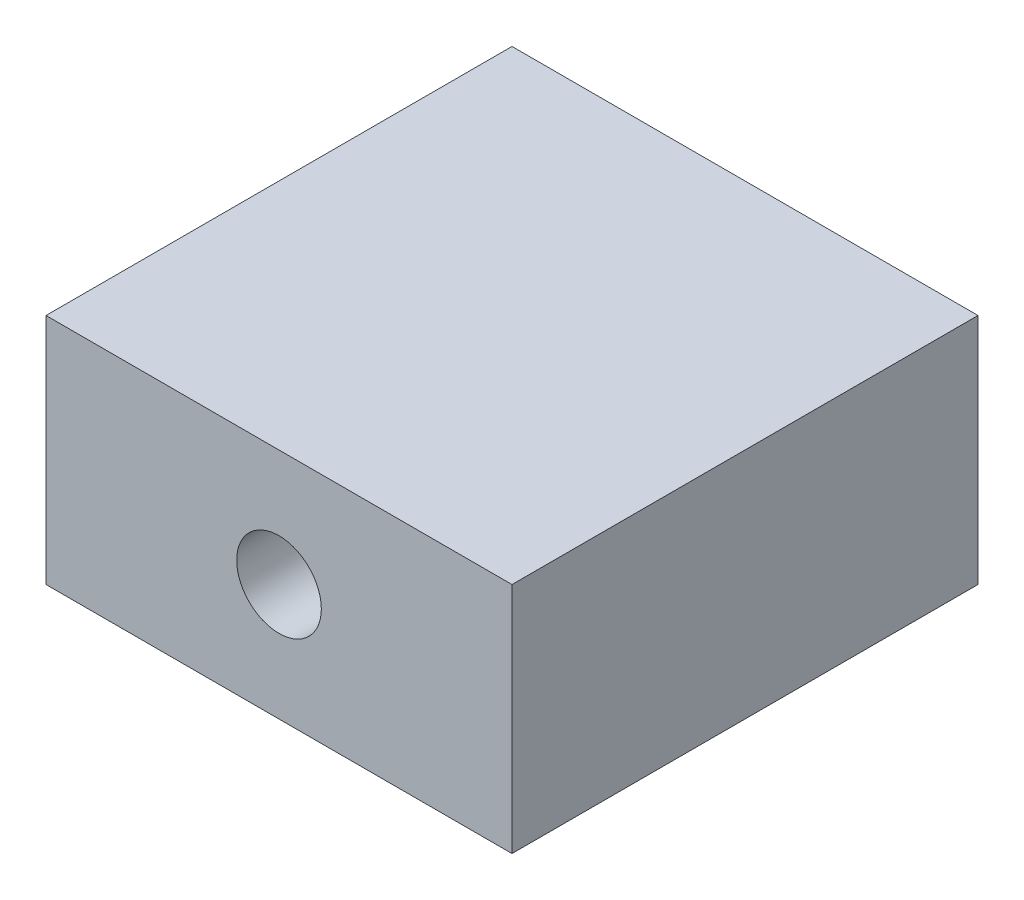
ISO-10303-21;
HEADER;
FILE_DESCRIPTION(('STEP AP214'),'2;1');
FILE_NAME('part.step','',(''),(''),'','','');
FILE_SCHEMA(('AUTOMOTIVE_DESIGN { 1 0 10303 214 1 1 1 1 }'));
ENDSEC;
DATA;
#1=APPLICATION_CONTEXT('core data for automotive mechanical design processes');
#2=APPLICATION_PROTOCOL_DEFINITION('international standard','automotive_design',2000,#1);
#3=PRODUCT_CONTEXT('',#1,'mechanical');
#4=PRODUCT('Part','Part','',(#3));
#5=PRODUCT_RELATED_PRODUCT_CATEGORY('part','',(#4));
#6=PRODUCT_DEFINITION_FORMATION('','',#4);
#7=PRODUCT_DEFINITION_CONTEXT('part definition',#1,'design');
#8=PRODUCT_DEFINITION('design','',#6,#7);
#9=PRODUCT_DEFINITION_SHAPE('','',#8);
#10=(LENGTH_UNIT() NAMED_UNIT(*) SI_UNIT(.MILLI.,.METRE.));
#11=(NAMED_UNIT(*) PLANE_ANGLE_UNIT() SI_UNIT($,.RADIAN.));
#12=(NAMED_UNIT(*) SI_UNIT($,.STERADIAN.) SOLID_ANGLE_UNIT());
#13=UNCERTAINTY_MEASURE_WITH_UNIT(LENGTH_MEASURE(1.E-05),#10,'distance_accuracy_value','');
#14=(GEOMETRIC_REPRESENTATION_CONTEXT(3) GLOBAL_UNCERTAINTY_ASSIGNED_CONTEXT((#13)) GLOBAL_UNIT_ASSIGNED_CONTEXT((#10,
#11,#12)) REPRESENTATION_CONTEXT('',''));
#15=CARTESIAN_POINT('',(0.,0.,0.));
#16=DIRECTION('',(0.,0.,1.));
#17=DIRECTION('',(1.,0.,0.));
#18=AXIS2_PLACEMENT_3D('',#15,#16,#17);
#19=CARTESIAN_POINT('',(76.2,-38.1,152.4));
#20=DIRECTION('',(-1.,0.,0.));
#21=DIRECTION('',(0.,0.,1.));
#22=AXIS2_PLACEMENT_3D('',#19,#20,#21);
#23=PLANE('',#22);
#24=DIRECTION('',(0.,1.,0.));
#25=VECTOR('',#24,1.);
#26=CARTESIAN_POINT('',(76.2,-38.1,0.));
#27=LINE('',#26,#25);
#28=CARTESIAN_POINT('',(76.2,-38.1,0.));
#29=VERTEX_POINT('',#28);
#30=CARTESIAN_POINT('',(76.2,38.1,0.));
#31=VERTEX_POINT('',#30);
#32=EDGE_CURVE('E106',#29,#31,#27,.T.);
#33=ORIENTED_EDGE('',*,*,#32,.T.);
#34=DIRECTION('',(0.,0.,-1.));
#35=VECTOR('',#34,1.);
#36=CARTESIAN_POINT('',(76.2,38.1,152.4));
#37=LINE('',#36,#35);
#38=CARTESIAN_POINT('',(76.2,38.1,152.4));
#39=VERTEX_POINT('',#38);
#40=EDGE_CURVE('E11',#39,#31,#37,.T.);
#41=ORIENTED_EDGE('',*,*,#40,.F.);
#42=DIRECTION('',(0.,1.,0.));
#43=VECTOR('',#42,1.);
#44=CARTESIAN_POINT('',(76.2,-38.1,152.4));
#45=LINE('',#44,#43);
#46=CARTESIAN_POINT('',(76.2,-38.1,152.4));
#47=VERTEX_POINT('',#46);
#48=EDGE_CURVE('E94',#47,#39,#45,.T.);
#49=ORIENTED_EDGE('',*,*,#48,.F.);
#50=DIRECTION('',(0.,0.,-1.));
#51=VECTOR('',#50,1.);
#52=CARTESIAN_POINT('',(76.2,-38.1,152.4));
#53=LINE('',#52,#51);
#54=EDGE_CURVE('E102',#47,#29,#53,.T.);
#55=ORIENTED_EDGE('',*,*,#54,.T.);
#56=EDGE_LOOP('',(#33,#41,#49,#55));
#57=FACE_BOUND('',#56,.T.);
#58=ADVANCED_FACE('F43',(#57),#23,.F.);
#59=CARTESIAN_POINT('',(-76.2,38.1,152.4));
#60=DIRECTION('',(0.,-1.,0.));
#61=DIRECTION('',(0.,0.,-1.));
#62=AXIS2_PLACEMENT_3D('',#59,#60,#61);
#63=PLANE('',#62);
#64=DIRECTION('',(-1.,0.,0.));
#65=VECTOR('',#64,1.);
#66=CARTESIAN_POINT('',(-76.2,38.1,0.));
#67=LINE('',#66,#65);
#68=CARTESIAN_POINT('',(-76.2,38.1,0.));
#69=VERTEX_POINT('',#68);
#70=EDGE_CURVE('E98',#31,#69,#67,.T.);
#71=ORIENTED_EDGE('',*,*,#70,.T.);
#72=DIRECTION('',(0.,0.,-1.));
#73=VECTOR('',#72,1.);
#74=CARTESIAN_POINT('',(-76.2,38.1,152.4));
#75=LINE('',#74,#73);
#76=CARTESIAN_POINT('',(-76.2,38.1,152.4));
#77=VERTEX_POINT('',#76);
#78=EDGE_CURVE('E51',#77,#69,#75,.T.);
#79=ORIENTED_EDGE('',*,*,#78,.F.);
#80=DIRECTION('',(-1.,0.,0.));
#81=VECTOR('',#80,1.);
#82=CARTESIAN_POINT('',(-76.2,38.1,152.4));
#83=LINE('',#82,#81);
#84=EDGE_CURVE('E89',#39,#77,#83,.T.);
#85=ORIENTED_EDGE('',*,*,#84,.F.);
#86=ORIENTED_EDGE('',*,*,#40,.T.);
#87=EDGE_LOOP('',(#71,#79,#85,#86));
#88=FACE_BOUND('',#87,.T.);
#89=ADVANCED_FACE('F97',(#88),#63,.F.);
#90=CARTESIAN_POINT('',(-76.2,-38.1,152.4));
#91=DIRECTION('',(1.,0.,0.));
#92=DIRECTION('',(0.,0.,-1.));
#93=AXIS2_PLACEMENT_3D('',#90,#91,#92);
#94=PLANE('',#93);
#95=DIRECTION('',(0.,-1.,0.));
#96=VECTOR('',#95,1.);
#97=CARTESIAN_POINT('',(-76.2,-38.1,0.));
#98=LINE('',#97,#96);
#99=CARTESIAN_POINT('',(-76.2,-38.1,0.));
#100=VERTEX_POINT('',#99);
#101=EDGE_CURVE('E76',#69,#100,#98,.T.);
#102=ORIENTED_EDGE('',*,*,#101,.T.);
#103=DIRECTION('',(0.,0.,-1.));
#104=VECTOR('',#103,1.);
#105=CARTESIAN_POINT('',(-76.2,-38.1,152.4));
#106=LINE('',#105,#104);
#107=CARTESIAN_POINT('',(-76.2,-38.1,152.4));
#108=VERTEX_POINT('',#107);
#109=EDGE_CURVE('E99',#108,#100,#106,.T.);
#110=ORIENTED_EDGE('',*,*,#109,.F.);
#111=DIRECTION('',(0.,-1.,0.));
#112=VECTOR('',#111,1.);
#113=CARTESIAN_POINT('',(-76.2,-38.1,152.4));
#114=LINE('',#113,#112);
#115=EDGE_CURVE('E92',#77,#108,#114,.T.);
#116=ORIENTED_EDGE('',*,*,#115,.F.);
#117=ORIENTED_EDGE('',*,*,#78,.T.);
#118=EDGE_LOOP('',(#102,#110,#116,#117));
#119=FACE_BOUND('',#118,.T.);
#120=ADVANCED_FACE('F100',(#119),#94,.F.);
#121=CARTESIAN_POINT('',(-76.2,-38.1,152.4));
#122=DIRECTION('',(0.,1.,0.));
#123=DIRECTION('',(0.,0.,1.));
#124=AXIS2_PLACEMENT_3D('',#121,#122,#123);
#125=PLANE('',#124);
#126=DIRECTION('',(1.,0.,0.));
#127=VECTOR('',#126,1.);
#128=CARTESIAN_POINT('',(-76.2,-38.1,0.));
#129=LINE('',#128,#127);
#130=EDGE_CURVE('E82',#100,#29,#129,.T.);
#131=ORIENTED_EDGE('',*,*,#130,.T.);
#132=ORIENTED_EDGE('',*,*,#54,.F.);
#133=DIRECTION('',(1.,0.,0.));
#134=VECTOR('',#133,1.);
#135=CARTESIAN_POINT('',(-76.2,-38.1,152.4));
#136=LINE('',#135,#134);
#137=EDGE_CURVE('E59',#108,#47,#136,.T.);
#138=ORIENTED_EDGE('',*,*,#137,.F.);
#139=ORIENTED_EDGE('',*,*,#109,.T.);
#140=EDGE_LOOP('',(#131,#132,#138,#139));
#141=FACE_BOUND('',#140,.T.);
#142=ADVANCED_FACE('F114',(#141),#125,.F.);
#143=CARTESIAN_POINT('',(0.,0.,152.4));
#144=DIRECTION('',(0.,0.,-1.));
#145=DIRECTION('',(-1.,0.,0.));
#146=AXIS2_PLACEMENT_3D('',#143,#144,#145);
#147=PLANE('',#146);
#148=CARTESIAN_POINT('',(0.,0.,152.4));
#149=DIRECTION('',(0.,0.,1.));
#150=DIRECTION('',(1.,0.,0.));
#151=AXIS2_PLACEMENT_3D('',#148,#149,#150);
#152=CIRCLE('',#151,13.843);
#153=CARTESIAN_POINT('',(13.843,0.,152.4));
#154=VERTEX_POINT('',#153);
#155=EDGE_CURVE('E109',#154,#154,#152,.T.);
#156=ORIENTED_EDGE('',*,*,#155,.F.);
#157=EDGE_LOOP('',(#156));
#158=FACE_BOUND('',#157,.T.);
#159=ORIENTED_EDGE('',*,*,#48,.T.);
#160=ORIENTED_EDGE('',*,*,#84,.T.);
#161=ORIENTED_EDGE('',*,*,#115,.T.);
#162=ORIENTED_EDGE('',*,*,#137,.T.);
#163=EDGE_LOOP('',(#159,#160,#161,#162));
#164=FACE_BOUND('',#163,.T.);
#165=ADVANCED_FACE('F90',(#158,#164),#147,.F.);
#166=CARTESIAN_POINT('',(0.,0.,0.));
#167=DIRECTION('',(0.,0.,-1.));
#168=DIRECTION('',(-1.,0.,0.));
#169=AXIS2_PLACEMENT_3D('',#166,#167,#168);
#170=PLANE('',#169);
#171=CARTESIAN_POINT('',(0.,0.,0.));
#172=DIRECTION('',(0.,0.,1.));
#173=DIRECTION('',(1.,0.,0.));
#174=AXIS2_PLACEMENT_3D('',#171,#172,#173);
#175=CIRCLE('',#174,13.843);
#176=CARTESIAN_POINT('',(13.843,0.,0.));
#177=VERTEX_POINT('',#176);
#178=EDGE_CURVE('E120',#177,#177,#175,.T.);
#179=ORIENTED_EDGE('',*,*,#178,.T.);
#180=EDGE_LOOP('',(#179));
#181=FACE_BOUND('',#180,.T.);
#182=ORIENTED_EDGE('',*,*,#32,.F.);
#183=ORIENTED_EDGE('',*,*,#130,.F.);
#184=ORIENTED_EDGE('',*,*,#101,.F.);
#185=ORIENTED_EDGE('',*,*,#70,.F.);
#186=EDGE_LOOP('',(#182,#183,#184,#185));
#187=FACE_BOUND('',#186,.T.);
#188=ADVANCED_FACE('F117',(#181,#187),#170,.T.);
#189=CARTESIAN_POINT('',(0.,0.,152.4));
#190=DIRECTION('',(0.,0.,-1.));
#191=DIRECTION('',(-1.,0.,0.));
#192=AXIS2_PLACEMENT_3D('',#189,#190,#191);
#193=CYLINDRICAL_SURFACE('',#192,13.843);
#194=ORIENTED_EDGE('',*,*,#155,.T.);
#195=EDGE_LOOP('',(#194));
#196=FACE_BOUND('',#195,.T.);
#197=ORIENTED_EDGE('',*,*,#178,.F.);
#198=EDGE_LOOP('',(#197));
#199=FACE_BOUND('',#198,.T.);
#200=ADVANCED_FACE('F126',(#196,#199),#193,.F.);
#201=CLOSED_SHELL('',(#58,#89,#120,#142,#165,#188,#200));
#202=MANIFOLD_SOLID_BREP('B2',#201);
#203=ADVANCED_BREP_SHAPE_REPRESENTATION('',(#18,#202),#14);
#204=SHAPE_DEFINITION_REPRESENTATION(#9,#203);
ENDSEC;
END-ISO-10303-21;
